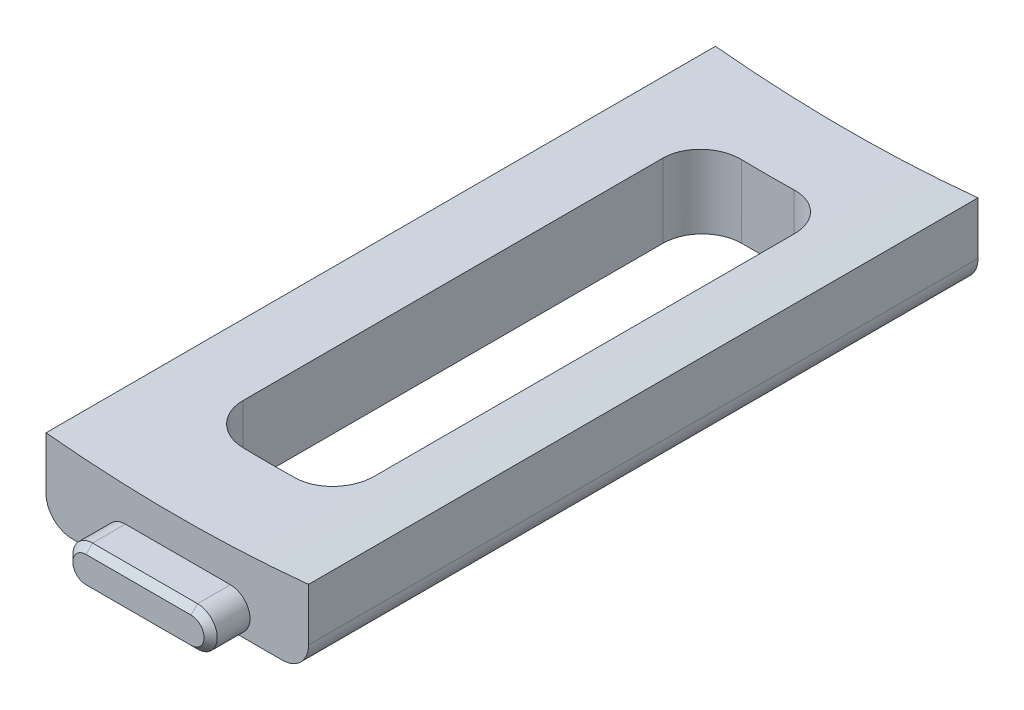
ISO-10303-21;
HEADER;
FILE_DESCRIPTION(('STEP AP214'),'2;1');
FILE_NAME('part.step','',(''),(''),'','','');
FILE_SCHEMA(('AUTOMOTIVE_DESIGN { 1 0 10303 214 1 1 1 1 }'));
ENDSEC;
DATA;
#1=APPLICATION_CONTEXT('core data for automotive mechanical design processes');
#2=APPLICATION_PROTOCOL_DEFINITION('international standard','automotive_design',2000,#1);
#3=PRODUCT_CONTEXT('',#1,'mechanical');
#4=PRODUCT('Part','Part','',(#3));
#5=PRODUCT_RELATED_PRODUCT_CATEGORY('part','',(#4));
#6=PRODUCT_DEFINITION_FORMATION('','',#4);
#7=PRODUCT_DEFINITION_CONTEXT('part definition',#1,'design');
#8=PRODUCT_DEFINITION('design','',#6,#7);
#9=PRODUCT_DEFINITION_SHAPE('','',#8);
#10=(LENGTH_UNIT() NAMED_UNIT(*) SI_UNIT(.MILLI.,.METRE.));
#11=(NAMED_UNIT(*) PLANE_ANGLE_UNIT() SI_UNIT($,.RADIAN.));
#12=(NAMED_UNIT(*) SI_UNIT($,.STERADIAN.) SOLID_ANGLE_UNIT());
#13=UNCERTAINTY_MEASURE_WITH_UNIT(LENGTH_MEASURE(1.E-05),#10,'distance_accuracy_value','');
#14=(GEOMETRIC_REPRESENTATION_CONTEXT(3) GLOBAL_UNCERTAINTY_ASSIGNED_CONTEXT((#13)) GLOBAL_UNIT_ASSIGNED_CONTEXT((#10,
#11,#12)) REPRESENTATION_CONTEXT('',''));
#15=CARTESIAN_POINT('',(0.,0.,0.));
#16=DIRECTION('',(0.,0.,1.));
#17=DIRECTION('',(1.,0.,0.));
#18=AXIS2_PLACEMENT_3D('',#15,#16,#17);
#19=CARTESIAN_POINT('',(-4.,0.,3.));
#20=DIRECTION('',(0.,0.,-1.));
#21=DIRECTION('',(-1.,0.,0.));
#22=AXIS2_PLACEMENT_3D('',#19,#20,#21);
#23=CYLINDRICAL_SURFACE('',#22,1.5);
#24=DIRECTION('',(0.,0.,-1.));
#25=VECTOR('',#24,1.);
#26=CARTESIAN_POINT('',(-4.,1.5,3.));
#27=LINE('',#26,#25);
#28=CARTESIAN_POINT('',(-4.,1.5,3.));
#29=VERTEX_POINT('',#28);
#30=CARTESIAN_POINT('',(-4.,1.5,0.500000000000014));
#31=VERTEX_POINT('',#30);
#32=EDGE_CURVE('E284',#29,#31,#27,.T.);
#33=ORIENTED_EDGE('',*,*,#32,.T.);
#34=CARTESIAN_POINT('',(-4.,0.,0.500000000000014));
#35=DIRECTION('',(0.,0.,1.));
#36=DIRECTION('',(1.,0.,0.));
#37=AXIS2_PLACEMENT_3D('',#34,#35,#36);
#38=CIRCLE('',#37,1.5);
#39=CARTESIAN_POINT('',(-4.,-1.5,0.500000000000014));
#40=VERTEX_POINT('',#39);
#41=EDGE_CURVE('E346',#31,#40,#38,.T.);
#42=ORIENTED_EDGE('',*,*,#41,.T.);
#43=DIRECTION('',(0.,0.,-1.));
#44=VECTOR('',#43,1.);
#45=CARTESIAN_POINT('',(-4.,-1.5,3.));
#46=LINE('',#45,#44);
#47=CARTESIAN_POINT('',(-4.,-1.5,3.));
#48=VERTEX_POINT('',#47);
#49=EDGE_CURVE('E293',#48,#40,#46,.T.);
#50=ORIENTED_EDGE('',*,*,#49,.F.);
#51=CARTESIAN_POINT('',(-4.,0.,3.));
#52=DIRECTION('',(0.,0.,1.));
#53=DIRECTION('',(1.,0.,0.));
#54=AXIS2_PLACEMENT_3D('',#51,#52,#53);
#55=CIRCLE('',#54,1.5);
#56=EDGE_CURVE('E275',#29,#48,#55,.T.);
#57=ORIENTED_EDGE('',*,*,#56,.F.);
#58=EDGE_LOOP('',(#33,#42,#50,#57));
#59=FACE_BOUND('',#58,.T.);
#60=ADVANCED_FACE('F36',(#59),#23,.T.);
#61=CARTESIAN_POINT('',(-4.,-1.5,3.));
#62=DIRECTION('',(0.,1.,0.));
#63=DIRECTION('',(0.,0.,1.));
#64=AXIS2_PLACEMENT_3D('',#61,#62,#63);
#65=PLANE('',#64);
#66=DIRECTION('',(-1.,0.,0.));
#67=VECTOR('',#66,1.);
#68=CARTESIAN_POINT('',(-5.,-1.5,47.));
#69=LINE('',#68,#67);
#70=CARTESIAN_POINT('',(2.,-1.5,47.));
#71=VERTEX_POINT('',#70);
#72=CARTESIAN_POINT('',(-2.,-1.5,47.));
#73=VERTEX_POINT('',#72);
#74=EDGE_CURVE('E745',#71,#73,#69,.T.);
#75=ORIENTED_EDGE('',*,*,#74,.F.);
#76=CARTESIAN_POINT('',(2.,-1.5,44.));
#77=DIRECTION('',(0.,1.,0.));
#78=DIRECTION('',(0.,0.,1.));
#79=AXIS2_PLACEMENT_3D('',#76,#77,#78);
#80=CIRCLE('',#79,3.);
#81=CARTESIAN_POINT('',(5.,-1.5,44.));
#82=VERTEX_POINT('',#81);
#83=EDGE_CURVE('E49',#71,#82,#80,.T.);
#84=ORIENTED_EDGE('',*,*,#83,.T.);
#85=DIRECTION('',(0.,0.,1.));
#86=VECTOR('',#85,1.);
#87=CARTESIAN_POINT('',(5.,-1.5,47.));
#88=LINE('',#87,#86);
#89=CARTESIAN_POINT('',(5.,-1.5,12.));
#90=VERTEX_POINT('',#89);
#91=EDGE_CURVE('E760',#90,#82,#88,.T.);
#92=ORIENTED_EDGE('',*,*,#91,.F.);
#93=CARTESIAN_POINT('',(2.,-1.5,12.));
#94=DIRECTION('',(0.,1.,0.));
#95=DIRECTION('',(0.,0.,1.));
#96=AXIS2_PLACEMENT_3D('',#93,#94,#95);
#97=CIRCLE('',#96,3.);
#98=CARTESIAN_POINT('',(2.,-1.5,9.00000000000001));
#99=VERTEX_POINT('',#98);
#100=EDGE_CURVE('E399',#90,#99,#97,.T.);
#101=ORIENTED_EDGE('',*,*,#100,.T.);
#102=DIRECTION('',(1.,0.,0.));
#103=VECTOR('',#102,1.);
#104=CARTESIAN_POINT('',(-5.,-1.5,9.00000000000001));
#105=LINE('',#104,#103);
#106=CARTESIAN_POINT('',(-2.,-1.5,9.00000000000001));
#107=VERTEX_POINT('',#106);
#108=EDGE_CURVE('E362',#107,#99,#105,.T.);
#109=ORIENTED_EDGE('',*,*,#108,.F.);
#110=CARTESIAN_POINT('',(-2.,-1.5,12.));
#111=DIRECTION('',(0.,1.,0.));
#112=DIRECTION('',(0.,0.,1.));
#113=AXIS2_PLACEMENT_3D('',#110,#111,#112);
#114=CIRCLE('',#113,3.);
#115=CARTESIAN_POINT('',(-5.,-1.5,12.));
#116=VERTEX_POINT('',#115);
#117=EDGE_CURVE('E407',#107,#116,#114,.T.);
#118=ORIENTED_EDGE('',*,*,#117,.T.);
#119=DIRECTION('',(0.,0.,-1.));
#120=VECTOR('',#119,1.);
#121=CARTESIAN_POINT('',(-5.,-1.5,47.));
#122=LINE('',#121,#120);
#123=CARTESIAN_POINT('',(-5.,-1.5,44.));
#124=VERTEX_POINT('',#123);
#125=EDGE_CURVE('E750',#124,#116,#122,.T.);
#126=ORIENTED_EDGE('',*,*,#125,.F.);
#127=CARTESIAN_POINT('',(-2.,-1.5,44.));
#128=DIRECTION('',(0.,1.,0.));
#129=DIRECTION('',(0.,0.,1.));
#130=AXIS2_PLACEMENT_3D('',#127,#128,#129);
#131=CIRCLE('',#130,3.);
#132=EDGE_CURVE('E56',#124,#73,#131,.T.);
#133=ORIENTED_EDGE('',*,*,#132,.T.);
#134=EDGE_LOOP('',(#75,#84,#92,#101,#109,#118,#126,#133));
#135=FACE_BOUND('',#134,.T.);
#136=DIRECTION('',(0.,0.,-1.));
#137=VECTOR('',#136,1.);
#138=CARTESIAN_POINT('',(4.04526737848605,-1.5,57.));
#139=LINE('',#138,#137);
#140=CARTESIAN_POINT('',(4.04526737848605,-1.5,56.5));
#141=VERTEX_POINT('',#140);
#142=CARTESIAN_POINT('',(4.04526737848605,-1.5,54.));
#143=VERTEX_POINT('',#142);
#144=EDGE_CURVE('E224',#141,#143,#139,.T.);
#145=ORIENTED_EDGE('',*,*,#144,.F.);
#146=DIRECTION('',(-1.,0.,0.));
#147=VECTOR('',#146,1.);
#148=CARTESIAN_POINT('',(-3.95473262151394,-1.5,56.5));
#149=LINE('',#148,#147);
#150=CARTESIAN_POINT('',(-3.95473262151394,-1.5,56.5));
#151=VERTEX_POINT('',#150);
#152=EDGE_CURVE('E329',#141,#151,#149,.T.);
#153=ORIENTED_EDGE('',*,*,#152,.T.);
#154=DIRECTION('',(0.,0.,-1.));
#155=VECTOR('',#154,1.);
#156=CARTESIAN_POINT('',(-3.95473262151394,-1.5,57.));
#157=LINE('',#156,#155);
#158=CARTESIAN_POINT('',(-3.95473262151394,-1.5,54.));
#159=VERTEX_POINT('',#158);
#160=EDGE_CURVE('E247',#151,#159,#157,.T.);
#161=ORIENTED_EDGE('',*,*,#160,.T.);
#162=DIRECTION('',(1.,0.,0.));
#163=VECTOR('',#162,1.);
#164=CARTESIAN_POINT('',(0.,-1.5,54.));
#165=LINE('',#164,#163);
#166=CARTESIAN_POINT('',(-8.,-1.5,54.));
#167=VERTEX_POINT('',#166);
#168=EDGE_CURVE('E250',#167,#159,#165,.T.);
#169=ORIENTED_EDGE('',*,*,#168,.F.);
#170=DIRECTION('',(0.,0.,-1.));
#171=VECTOR('',#170,1.);
#172=CARTESIAN_POINT('',(-8.,-1.5,3.));
#173=LINE('',#172,#171);
#174=CARTESIAN_POINT('',(-8.,-1.5,3.));
#175=VERTEX_POINT('',#174);
#176=EDGE_CURVE('E303',#167,#175,#173,.T.);
#177=ORIENTED_EDGE('',*,*,#176,.T.);
#178=DIRECTION('',(1.,0.,0.));
#179=VECTOR('',#178,1.);
#180=CARTESIAN_POINT('',(0.,-1.5,3.));
#181=LINE('',#180,#179);
#182=EDGE_CURVE('E261',#175,#48,#181,.T.);
#183=ORIENTED_EDGE('',*,*,#182,.T.);
#184=ORIENTED_EDGE('',*,*,#49,.T.);
#185=DIRECTION('',(1.,0.,0.));
#186=VECTOR('',#185,1.);
#187=CARTESIAN_POINT('',(-4.,-1.5,0.500000000000014));
#188=LINE('',#187,#186);
#189=CARTESIAN_POINT('',(4.,-1.5,0.500000000000014));
#190=VERTEX_POINT('',#189);
#191=EDGE_CURVE('E326',#40,#190,#188,.T.);
#192=ORIENTED_EDGE('',*,*,#191,.T.);
#193=DIRECTION('',(0.,0.,-1.));
#194=VECTOR('',#193,1.);
#195=CARTESIAN_POINT('',(4.,-1.5,3.));
#196=LINE('',#195,#194);
#197=CARTESIAN_POINT('',(4.,-1.5,3.));
#198=VERTEX_POINT('',#197);
#199=EDGE_CURVE('E290',#198,#190,#196,.T.);
#200=ORIENTED_EDGE('',*,*,#199,.F.);
#201=CARTESIAN_POINT('',(8.,-1.5,3.));
#202=VERTEX_POINT('',#201);
#203=EDGE_CURVE('E249',#198,#202,#181,.T.);
#204=ORIENTED_EDGE('',*,*,#203,.T.);
#205=DIRECTION('',(0.,0.,-1.));
#206=VECTOR('',#205,1.);
#207=CARTESIAN_POINT('',(8.,-1.5,3.));
#208=LINE('',#207,#206);
#209=CARTESIAN_POINT('',(8.,-1.5,54.));
#210=VERTEX_POINT('',#209);
#211=EDGE_CURVE('E306',#202,#210,#208,.F.);
#212=ORIENTED_EDGE('',*,*,#211,.T.);
#213=EDGE_CURVE('E253',#143,#210,#165,.T.);
#214=ORIENTED_EDGE('',*,*,#213,.F.);
#215=EDGE_LOOP('',(#145,#153,#161,#169,#177,#183,#184,#192,#200,#204,#212,#214));
#216=FACE_BOUND('',#215,.T.);
#217=ADVANCED_FACE('F451',(#135,#216),#65,.F.);
#218=CARTESIAN_POINT('',(4.,0.,3.));
#219=DIRECTION('',(0.,0.,-1.));
#220=DIRECTION('',(-1.,0.,0.));
#221=AXIS2_PLACEMENT_3D('',#218,#219,#220);
#222=CYLINDRICAL_SURFACE('',#221,1.5);
#223=ORIENTED_EDGE('',*,*,#199,.T.);
#224=CARTESIAN_POINT('',(4.,0.,0.500000000000014));
#225=DIRECTION('',(0.,0.,1.));
#226=DIRECTION('',(1.,0.,0.));
#227=AXIS2_PLACEMENT_3D('',#224,#225,#226);
#228=CIRCLE('',#227,1.5);
#229=CARTESIAN_POINT('',(4.,1.5,0.500000000000014));
#230=VERTEX_POINT('',#229);
#231=EDGE_CURVE('E342',#190,#230,#228,.T.);
#232=ORIENTED_EDGE('',*,*,#231,.T.);
#233=DIRECTION('',(0.,0.,-1.));
#234=VECTOR('',#233,1.);
#235=CARTESIAN_POINT('',(4.,1.5,3.));
#236=LINE('',#235,#234);
#237=CARTESIAN_POINT('',(4.,1.5,3.));
#238=VERTEX_POINT('',#237);
#239=EDGE_CURVE('E287',#238,#230,#236,.T.);
#240=ORIENTED_EDGE('',*,*,#239,.F.);
#241=CARTESIAN_POINT('',(4.,0.,3.));
#242=DIRECTION('',(0.,0.,1.));
#243=DIRECTION('',(1.,0.,0.));
#244=AXIS2_PLACEMENT_3D('',#241,#242,#243);
#245=CIRCLE('',#244,1.5);
#246=EDGE_CURVE('E278',#198,#238,#245,.T.);
#247=ORIENTED_EDGE('',*,*,#246,.F.);
#248=EDGE_LOOP('',(#223,#232,#240,#247));
#249=FACE_BOUND('',#248,.T.);
#250=ADVANCED_FACE('F457',(#249),#222,.T.);
#251=CARTESIAN_POINT('',(-4.,1.5,3.));
#252=DIRECTION('',(0.,-1.,0.));
#253=DIRECTION('',(0.,0.,-1.));
#254=AXIS2_PLACEMENT_3D('',#251,#252,#253);
#255=PLANE('',#254);
#256=ORIENTED_EDGE('',*,*,#239,.T.);
#257=DIRECTION('',(-1.,0.,0.));
#258=VECTOR('',#257,1.);
#259=CARTESIAN_POINT('',(-4.,1.5,0.500000000000014));
#260=LINE('',#259,#258);
#261=EDGE_CURVE('E344',#230,#31,#260,.T.);
#262=ORIENTED_EDGE('',*,*,#261,.T.);
#263=ORIENTED_EDGE('',*,*,#32,.F.);
#264=DIRECTION('',(-1.,0.,0.));
#265=VECTOR('',#264,1.);
#266=CARTESIAN_POINT('',(-4.,1.5,3.));
#267=LINE('',#266,#265);
#268=EDGE_CURVE('E281',#238,#29,#267,.T.);
#269=ORIENTED_EDGE('',*,*,#268,.F.);
#270=EDGE_LOOP('',(#256,#262,#263,#269));
#271=FACE_BOUND('',#270,.T.);
#272=ADVANCED_FACE('F529',(#271),#255,.F.);
#273=CARTESIAN_POINT('',(-4.,0.,0.));
#274=DIRECTION('',(0.,0.,1.));
#275=DIRECTION('',(1.,0.,0.));
#276=AXIS2_PLACEMENT_3D('',#273,#274,#275);
#277=PLANE('',#276);
#278=CARTESIAN_POINT('',(4.,0.,0.));
#279=DIRECTION('',(0.,0.,1.));
#280=DIRECTION('',(1.,0.,0.));
#281=AXIS2_PLACEMENT_3D('',#278,#279,#280);
#282=CIRCLE('',#281,0.999999999999987);
#283=CARTESIAN_POINT('',(4.,0.999999999999987,0.));
#284=VERTEX_POINT('',#283);
#285=CARTESIAN_POINT('',(4.,-0.999999999999985,0.));
#286=VERTEX_POINT('',#285);
#287=EDGE_CURVE('E337',#284,#286,#282,.F.);
#288=ORIENTED_EDGE('',*,*,#287,.T.);
#289=DIRECTION('',(-1.,0.,0.));
#290=VECTOR('',#289,1.);
#291=CARTESIAN_POINT('',(-4.,-0.999999999999987,0.));
#292=LINE('',#291,#290);
#293=CARTESIAN_POINT('',(-4.,-0.999999999999987,0.));
#294=VERTEX_POINT('',#293);
#295=EDGE_CURVE('E339',#286,#294,#292,.T.);
#296=ORIENTED_EDGE('',*,*,#295,.T.);
#297=CARTESIAN_POINT('',(-4.,0.,0.));
#298=DIRECTION('',(0.,0.,1.));
#299=DIRECTION('',(1.,0.,0.));
#300=AXIS2_PLACEMENT_3D('',#297,#298,#299);
#301=CIRCLE('',#300,0.999999999999987);
#302=CARTESIAN_POINT('',(-4.,0.999999999999987,0.));
#303=VERTEX_POINT('',#302);
#304=EDGE_CURVE('E333',#294,#303,#301,.F.);
#305=ORIENTED_EDGE('',*,*,#304,.T.);
#306=DIRECTION('',(1.,0.,0.));
#307=VECTOR('',#306,1.);
#308=CARTESIAN_POINT('',(-4.,0.999999999999987,0.));
#309=LINE('',#308,#307);
#310=EDGE_CURVE('E335',#303,#284,#309,.T.);
#311=ORIENTED_EDGE('',*,*,#310,.T.);
#312=EDGE_LOOP('',(#288,#296,#305,#311));
#313=FACE_BOUND('',#312,.T.);
#314=ADVANCED_FACE('F512',(#313),#277,.F.);
#315=CARTESIAN_POINT('',(0.,0.,3.));
#316=DIRECTION('',(0.,0.,1.));
#317=DIRECTION('',(1.,0.,0.));
#318=AXIS2_PLACEMENT_3D('',#315,#316,#317);
#319=PLANE('',#318);
#320=DIRECTION('',(0.,1.,0.));
#321=VECTOR('',#320,1.);
#322=CARTESIAN_POINT('',(10.,0.,3.));
#323=LINE('',#322,#321);
#324=CARTESIAN_POINT('',(10.,0.5,3.));
#325=VERTEX_POINT('',#324);
#326=CARTESIAN_POINT('',(10.,4.50125628933799,3.));
#327=VERTEX_POINT('',#326);
#328=EDGE_CURVE('E263',#325,#327,#323,.T.);
#329=ORIENTED_EDGE('',*,*,#328,.F.);
#330=CARTESIAN_POINT('',(8.,0.5,3.));
#331=DIRECTION('',(0.,0.,1.));
#332=DIRECTION('',(1.,0.,0.));
#333=AXIS2_PLACEMENT_3D('',#330,#331,#332);
#334=CIRCLE('',#333,2.);
#335=EDGE_CURVE('E301',#325,#202,#334,.F.);
#336=ORIENTED_EDGE('',*,*,#335,.T.);
#337=ORIENTED_EDGE('',*,*,#203,.F.);
#338=ORIENTED_EDGE('',*,*,#246,.T.);
#339=ORIENTED_EDGE('',*,*,#268,.T.);
#340=ORIENTED_EDGE('',*,*,#56,.T.);
#341=ORIENTED_EDGE('',*,*,#182,.F.);
#342=CARTESIAN_POINT('',(-8.,0.5,3.));
#343=DIRECTION('',(0.,0.,1.));
#344=DIRECTION('',(1.,0.,0.));
#345=AXIS2_PLACEMENT_3D('',#342,#343,#344);
#346=CIRCLE('',#345,2.);
#347=CARTESIAN_POINT('',(-10.,0.5,3.));
#348=VERTEX_POINT('',#347);
#349=EDGE_CURVE('E299',#175,#348,#346,.F.);
#350=ORIENTED_EDGE('',*,*,#349,.T.);
#351=DIRECTION('',(0.,1.,0.));
#352=VECTOR('',#351,1.);
#353=CARTESIAN_POINT('',(-10.,0.,3.));
#354=LINE('',#353,#352);
#355=CARTESIAN_POINT('',(-10.,4.50125628933799,3.));
#356=VERTEX_POINT('',#355);
#357=EDGE_CURVE('E268',#348,#356,#354,.T.);
#358=ORIENTED_EDGE('',*,*,#357,.T.);
#359=CARTESIAN_POINT('',(0.,104.,3.));
#360=DIRECTION('',(0.,0.,1.));
#361=DIRECTION('',(1.,0.,0.));
#362=AXIS2_PLACEMENT_3D('',#359,#360,#361);
#363=CIRCLE('',#362,100.);
#364=EDGE_CURVE('E265',#356,#327,#363,.T.);
#365=ORIENTED_EDGE('',*,*,#364,.T.);
#366=EDGE_LOOP('',(#329,#336,#337,#338,#339,#340,#341,#350,#358,#365));
#367=FACE_BOUND('',#366,.T.);
#368=ADVANCED_FACE('F525',(#367),#319,.F.);
#369=CARTESIAN_POINT('',(10.,0.,54.));
#370=DIRECTION('',(-1.,0.,0.));
#371=DIRECTION('',(0.,0.,1.));
#372=AXIS2_PLACEMENT_3D('',#369,#370,#371);
#373=PLANE('',#372);
#374=DIRECTION('',(0.,1.,0.));
#375=VECTOR('',#374,1.);
#376=CARTESIAN_POINT('',(10.,0.,54.));
#377=LINE('',#376,#375);
#378=CARTESIAN_POINT('',(10.,0.5,54.));
#379=VERTEX_POINT('',#378);
#380=CARTESIAN_POINT('',(10.,4.50125628933799,54.));
#381=VERTEX_POINT('',#380);
#382=EDGE_CURVE('E252',#379,#381,#377,.T.);
#383=ORIENTED_EDGE('',*,*,#382,.F.);
#384=DIRECTION('',(0.,0.,-1.));
#385=VECTOR('',#384,1.);
#386=CARTESIAN_POINT('',(10.,0.5,54.));
#387=LINE('',#386,#385);
#388=EDGE_CURVE('E296',#379,#325,#387,.T.);
#389=ORIENTED_EDGE('',*,*,#388,.T.);
#390=ORIENTED_EDGE('',*,*,#328,.T.);
#391=DIRECTION('',(0.,0.,-1.));
#392=VECTOR('',#391,1.);
#393=CARTESIAN_POINT('',(10.,4.50125628933799,54.));
#394=LINE('',#393,#392);
#395=EDGE_CURVE('E272',#381,#327,#394,.T.);
#396=ORIENTED_EDGE('',*,*,#395,.F.);
#397=EDGE_LOOP('',(#383,#389,#390,#396));
#398=FACE_BOUND('',#397,.T.);
#399=ADVANCED_FACE('F419',(#398),#373,.F.);
#400=CARTESIAN_POINT('',(0.,104.,54.));
#401=DIRECTION('',(0.,0.,-1.));
#402=DIRECTION('',(-1.,0.,0.));
#403=AXIS2_PLACEMENT_3D('',#400,#401,#402);
#404=CYLINDRICAL_SURFACE('',#403,100.);
#405=DIRECTION('',(0.,0.,-1.));
#406=VECTOR('',#405,1.);
#407=CARTESIAN_POINT('',(5.,4.12507822280909,54.));
#408=LINE('',#407,#406);
#409=CARTESIAN_POINT('',(5.,4.12507822280909,44.));
#410=VERTEX_POINT('',#409);
#411=CARTESIAN_POINT('',(5.,4.12507822280909,12.));
#412=VERTEX_POINT('',#411);
#413=EDGE_CURVE('E377',#410,#412,#408,.T.);
#414=ORIENTED_EDGE('',*,*,#413,.F.);
#415=CARTESIAN_POINT('',(5.,4.12507822280909,44.));
#416=CARTESIAN_POINT('',(5.00000814498808,4.12507942660806,44.0843160906977));
#417=CARTESIAN_POINT('',(4.9964454317208,4.12490029257833,44.1686282933475));
#418=CARTESIAN_POINT('',(4.98224131947821,4.12419029589252,44.3366485934392));
#419=CARTESIAN_POINT('',(4.97160028692525,4.1236594514434,44.4203567219255));
#420=CARTESIAN_POINT('',(4.94331389716537,4.12225554217067,44.5865147692355));
#421=CARTESIAN_POINT('',(4.92567416179516,4.12138275202827,44.6689656429056));
#422=CARTESIAN_POINT('',(4.88353431607412,4.11931351210027,44.8320662889402));
#423=CARTESIAN_POINT('',(4.8590342841207,4.11811706601333,44.9127160818756));
#424=CARTESIAN_POINT('',(4.77544433383261,4.11407358765031,45.1511831389334));
#425=CARTESIAN_POINT('',(4.70625244283795,4.11077179098361,45.3055888764195));
#426=CARTESIAN_POINT('',(4.54301089354706,4.10321486399377,45.600479672758));
#427=CARTESIAN_POINT('',(4.44896522677314,4.09895988676834,45.7409669619397));
#428=CARTESIAN_POINT('',(4.23857940291584,4.08981278035046,46.0042867457742));
#429=CARTESIAN_POINT('',(4.12222359159134,4.08492020455435,46.1271067373688));
#430=CARTESIAN_POINT('',(3.87053536876305,4.07485410454384,46.351495264));
#431=CARTESIAN_POINT('',(3.73519919236742,4.06968052471531,46.4530595728336));
#432=CARTESIAN_POINT('',(3.44925947230159,4.0594022469929,46.6321368900896));
#433=CARTESIAN_POINT('',(3.29863944644853,4.05429763033532,46.7096235594207));
#434=CARTESIAN_POINT('',(2.98654410826975,4.04448559538443,46.8381630408096));
#435=CARTESIAN_POINT('',(2.82507523060225,4.03977794531494,46.8892313684061));
#436=CARTESIAN_POINT('',(2.55218908089319,4.03251473311917,46.9508397022361));
#437=CARTESIAN_POINT('',(2.44249163670902,4.02977292484892,46.969262693972));
#438=CARTESIAN_POINT('',(2.22187949302137,4.02462536896807,46.9938414457761));
#439=CARTESIAN_POINT('',(2.11096671661919,4.0222191553986,47.0000143754011));
#440=CARTESIAN_POINT('',(2.,4.02000200040009,47.));
#441=B_SPLINE_CURVE_WITH_KNOTS('',3,(#415,#416,#417,#418,#419,#420,#421,#422,#423,#424,#425,
#426,#427,#428,#429,#430,#431,#432,#433,#434,#435,#436,#437,#438,#439,#440),.UNSPECIFIED.,.F.,
.F.,(4,2,2,2,2,2,2,2,2,2,2,2,4),(0.,0.252865840559253,0.5057185920668,0.75836864483334,
1.01101581050838,1.51609737369479,2.02109786990451,2.52645401248504,3.03191053823899,
3.53791806377939,4.04362807185568,4.3767928331811,4.70949030358541),.UNSPECIFIED.);
#442=CARTESIAN_POINT('',(2.,4.02000200040009,47.));
#443=VERTEX_POINT('',#442);
#444=EDGE_CURVE('E11',#410,#443,#441,.T.);
#445=ORIENTED_EDGE('',*,*,#444,.T.);
#446=CARTESIAN_POINT('',(0.,104.,47.));
#447=DIRECTION('',(0.,0.,1.));
#448=DIRECTION('',(1.,0.,0.));
#449=AXIS2_PLACEMENT_3D('',#446,#447,#448);
#450=CIRCLE('',#449,100.);
#451=CARTESIAN_POINT('',(-2.,4.02000200040009,47.));
#452=VERTEX_POINT('',#451);
#453=EDGE_CURVE('E348',#452,#443,#450,.T.);
#454=ORIENTED_EDGE('',*,*,#453,.F.);
#455=CARTESIAN_POINT('',(-2.,4.02000200040009,47.));
#456=CARTESIAN_POINT('',(-2.08440471498158,4.02168939327337,47.0000080934784));
#457=CARTESIAN_POINT('',(-2.16880330050162,4.02348564658434,46.9964379549062));
#458=CARTESIAN_POINT('',(-2.3369915925235,4.02727626437532,46.9822049954182));
#459=CARTESIAN_POINT('',(-2.42078133028275,4.02927061860687,46.9715425412505));
#460=CARTESIAN_POINT('',(-2.58709954659007,4.03343638875262,46.9431997306214));
#461=CARTESIAN_POINT('',(-2.66962895416165,4.03560766594774,46.9255248310907));
#462=CARTESIAN_POINT('',(-2.83288133264196,4.04010071208988,46.8833014563639));
#463=CARTESIAN_POINT('',(-2.91360432373913,4.0424224793539,46.8587530580272));
#464=CARTESIAN_POINT('',(-3.15228277388182,4.04957059726669,46.7749982818057));
#465=CARTESIAN_POINT('',(-3.30681846820339,4.05458156104764,46.7056701984044));
#466=CARTESIAN_POINT('',(-3.60194081689673,4.0647814445783,46.5421026061555));
#467=CARTESIAN_POINT('',(-3.7425297737481,4.069970334763,46.4478672187218));
#468=CARTESIAN_POINT('',(-4.00597239863439,4.08018424599097,46.2370801080684));
#469=CARTESIAN_POINT('',(-4.12881906036724,4.08520920169465,46.1205196108619));
#470=CARTESIAN_POINT('',(-4.35321696997438,4.09473408526897,45.8683841263345));
#471=CARTESIAN_POINT('',(-4.45476410203139,4.09923391159177,45.7328054724686));
#472=CARTESIAN_POINT('',(-4.63364586562891,4.10737079152132,45.4465158388333));
#473=CARTESIAN_POINT('',(-4.71098119807191,4.11100787010284,45.2958052972807));
#474=CARTESIAN_POINT('',(-4.83920405745343,4.11713735039983,44.9835462928739));
#475=CARTESIAN_POINT('',(-4.89010741254306,4.11963043706295,44.8220043817223));
#476=CARTESIAN_POINT('',(-4.95131174276999,4.12264972550112,44.549553843368));
#477=CARTESIAN_POINT('',(-4.96955851069598,4.12355761625383,44.4403683586929));
#478=CARTESIAN_POINT('',(-4.99390114863837,4.12477287239238,44.220803988175));
#479=CARTESIAN_POINT('',(-5.00001409551737,4.12508108174403,44.1104269996644));
#480=CARTESIAN_POINT('',(-5.,4.1250782228091,44.));
#481=B_SPLINE_CURVE_WITH_KNOTS('',3,(#455,#456,#457,#458,#459,#460,#461,#462,#463,#464,#465,
#466,#467,#468,#469,#470,#471,#472,#473,#474,#475,#476,#477,#478,#479,#480),.UNSPECIFIED.,.F.,
.F.,(4,2,2,2,2,2,2,2,2,2,2,2,4),(0.,0.25318212149904,0.506351151816436,0.759323556776108,
1.01229313311201,1.51801956258096,2.02366236178129,2.52950429283466,3.0354438804494,
3.54136882036691,4.04699044895239,4.37847148811356,4.70948567671865),.UNSPECIFIED.);
#482=CARTESIAN_POINT('',(-5.,4.12507822280909,44.));
#483=VERTEX_POINT('',#482);
#484=EDGE_CURVE('E432',#452,#483,#481,.T.);
#485=ORIENTED_EDGE('',*,*,#484,.T.);
#486=DIRECTION('',(0.,0.,-1.));
#487=VECTOR('',#486,1.);
#488=CARTESIAN_POINT('',(-5.,4.12507822280909,54.));
#489=LINE('',#488,#487);
#490=CARTESIAN_POINT('',(-5.,4.12507822280909,12.));
#491=VERTEX_POINT('',#490);
#492=EDGE_CURVE('E371',#491,#483,#489,.F.);
#493=ORIENTED_EDGE('',*,*,#492,.F.);
#494=CARTESIAN_POINT('',(-5.,4.12507822280909,12.));
#495=CARTESIAN_POINT('',(-5.00000814498808,4.12507942660806,11.9156839093023));
#496=CARTESIAN_POINT('',(-4.9964454317208,4.12490029257833,11.8313717066525));
#497=CARTESIAN_POINT('',(-4.98224131947821,4.12419029589252,11.6633514065608));
#498=CARTESIAN_POINT('',(-4.97160028692524,4.1236594514434,11.5796432780745));
#499=CARTESIAN_POINT('',(-4.94331389716536,4.12225554217067,11.4134852307645));
#500=CARTESIAN_POINT('',(-4.92567416179516,4.12138275202827,11.3310343570944));
#501=CARTESIAN_POINT('',(-4.88353431607412,4.11931351210027,11.1679337110598));
#502=CARTESIAN_POINT('',(-4.8590342841207,4.11811706601333,11.0872839181244));
#503=CARTESIAN_POINT('',(-4.77544433383261,4.11407358765031,10.8488168610666));
#504=CARTESIAN_POINT('',(-4.70625244283795,4.11077179098361,10.6944111235805));
#505=CARTESIAN_POINT('',(-4.54301089354706,4.10321486399377,10.399520327242));
#506=CARTESIAN_POINT('',(-4.44896522677314,4.09895988676834,10.2590330380603));
#507=CARTESIAN_POINT('',(-4.23857940291584,4.08981278035046,9.99571325422579));
#508=CARTESIAN_POINT('',(-4.12222359159134,4.08492020455435,9.87289326263119));
#509=CARTESIAN_POINT('',(-3.87053536876306,4.07485410454384,9.64850473599997));
#510=CARTESIAN_POINT('',(-3.73519919236742,4.06968052471531,9.5469404271664));
#511=CARTESIAN_POINT('',(-3.44925947230159,4.0594022469929,9.36786310991036));
#512=CARTESIAN_POINT('',(-3.29863944644853,4.05429763033532,9.29037644057932));
#513=CARTESIAN_POINT('',(-2.98654410826975,4.04448559538443,9.16183695919041));
#514=CARTESIAN_POINT('',(-2.82507523060225,4.03977794531493,9.11076863159387));
#515=CARTESIAN_POINT('',(-2.55218908089319,4.03251473311918,9.04916029776391));
#516=CARTESIAN_POINT('',(-2.44249163670901,4.02977292484893,9.03073730602799));
#517=CARTESIAN_POINT('',(-2.22187949302136,4.02462536896809,9.0061585542239));
#518=CARTESIAN_POINT('',(-2.11096671661919,4.02221915539861,8.99998562459891));
#519=CARTESIAN_POINT('',(-2.,4.02000200040009,9.));
#520=B_SPLINE_CURVE_WITH_KNOTS('',3,(#494,#495,#496,#497,#498,#499,#500,#501,#502,#503,#504,
#505,#506,#507,#508,#509,#510,#511,#512,#513,#514,#515,#516,#517,#518,#519),.UNSPECIFIED.,.F.,
.F.,(4,2,2,2,2,2,2,2,2,2,2,2,4),(0.,0.252865840559264,0.505718592066802,0.758368644833338,
1.01101581050838,1.51609737369478,2.02109786990451,2.52645401248504,3.03191053823899,
3.5379180637794,4.04362807185568,4.3767928331811,4.70949030358541),.UNSPECIFIED.);
#521=CARTESIAN_POINT('',(-2.,4.02000200040009,9.));
#522=VERTEX_POINT('',#521);
#523=EDGE_CURVE('E426',#491,#522,#520,.T.);
#524=ORIENTED_EDGE('',*,*,#523,.T.);
#525=CARTESIAN_POINT('',(0.,104.,9.));
#526=DIRECTION('',(0.,0.,-1.));
#527=DIRECTION('',(-1.,0.,0.));
#528=AXIS2_PLACEMENT_3D('',#525,#526,#527);
#529=CIRCLE('',#528,100.);
#530=CARTESIAN_POINT('',(2.,4.02000200040009,9.));
#531=VERTEX_POINT('',#530);
#532=EDGE_CURVE('E374',#531,#522,#529,.T.);
#533=ORIENTED_EDGE('',*,*,#532,.F.);
#534=CARTESIAN_POINT('',(2.,4.02000200040009,9.00000000000001));
#535=CARTESIAN_POINT('',(2.08440471498158,4.02168939327337,8.99999190652156));
#536=CARTESIAN_POINT('',(2.16880330050162,4.02348564658434,9.00356204509384));
#537=CARTESIAN_POINT('',(2.3369915925235,4.02727626437532,9.01779500458177));
#538=CARTESIAN_POINT('',(2.42078133028275,4.02927061860687,9.02845745874952));
#539=CARTESIAN_POINT('',(2.58709954659007,4.03343638875262,9.05680026937857));
#540=CARTESIAN_POINT('',(2.66962895416166,4.03560766594774,9.0744751689093));
#541=CARTESIAN_POINT('',(2.83288133264196,4.04010071208988,9.11669854363612));
#542=CARTESIAN_POINT('',(2.91360432373913,4.0424224793539,9.14124694197276));
#543=CARTESIAN_POINT('',(3.15228277388182,4.04957059726669,9.22500171819434));
#544=CARTESIAN_POINT('',(3.30681846820339,4.05458156104764,9.29432980159558));
#545=CARTESIAN_POINT('',(3.60194081689673,4.0647814445783,9.45789739384448));
#546=CARTESIAN_POINT('',(3.7425297737481,4.069970334763,9.55213278127816));
#547=CARTESIAN_POINT('',(4.00597239863439,4.08018424599097,9.76291989193164));
#548=CARTESIAN_POINT('',(4.12881906036724,4.08520920169465,9.87948038913811));
#549=CARTESIAN_POINT('',(4.35321696997438,4.09473408526897,10.1316158736655));
#550=CARTESIAN_POINT('',(4.45476410203139,4.09923391159177,10.2671945275314));
#551=CARTESIAN_POINT('',(4.63364586562891,4.10737079152132,10.5534841611667));
#552=CARTESIAN_POINT('',(4.71098119807191,4.11100787010284,10.7041947027193));
#553=CARTESIAN_POINT('',(4.83920405745343,4.11713735039983,11.0164537071261));
#554=CARTESIAN_POINT('',(4.89010741254306,4.11963043706295,11.1779956182777));
#555=CARTESIAN_POINT('',(4.95131174276999,4.12264972550112,11.450446156632));
#556=CARTESIAN_POINT('',(4.96955851069598,4.12355761625383,11.5596316413071));
#557=CARTESIAN_POINT('',(4.99390114863837,4.12477287239238,11.779196011825));
#558=CARTESIAN_POINT('',(5.00001409551737,4.12508108174403,11.8895730003356));
#559=CARTESIAN_POINT('',(5.,4.1250782228091,12.));
#560=B_SPLINE_CURVE_WITH_KNOTS('',3,(#534,#535,#536,#537,#538,#539,#540,#541,#542,#543,#544,
#545,#546,#547,#548,#549,#550,#551,#552,#553,#554,#555,#556,#557,#558,#559),.UNSPECIFIED.,.F.,
.F.,(4,2,2,2,2,2,2,2,2,2,2,2,4),(0.,0.25318212149904,0.506351151816437,0.759323556776109,
1.01229313311201,1.51801956258096,2.02366236178129,2.52950429283466,3.0354438804494,
3.54136882036691,4.04699044895239,4.37847148811357,4.70948567671865),.UNSPECIFIED.);
#561=EDGE_CURVE('E401',#531,#412,#560,.T.);
#562=ORIENTED_EDGE('',*,*,#561,.T.);
#563=EDGE_LOOP('',(#414,#445,#454,#485,#493,#524,#533,#562));
#564=FACE_BOUND('',#563,.T.);
#565=ORIENTED_EDGE('',*,*,#364,.F.);
#566=DIRECTION('',(0.,0.,-1.));
#567=VECTOR('',#566,1.);
#568=CARTESIAN_POINT('',(-10.,4.50125628933799,54.));
#569=LINE('',#568,#567);
#570=CARTESIAN_POINT('',(-10.,4.50125628933799,54.));
#571=VERTEX_POINT('',#570);
#572=EDGE_CURVE('E260',#571,#356,#569,.T.);
#573=ORIENTED_EDGE('',*,*,#572,.F.);
#574=CARTESIAN_POINT('',(0.,104.,54.));
#575=DIRECTION('',(0.,0.,1.));
#576=DIRECTION('',(1.,0.,0.));
#577=AXIS2_PLACEMENT_3D('',#574,#575,#576);
#578=CIRCLE('',#577,100.);
#579=EDGE_CURVE('E255',#571,#381,#578,.T.);
#580=ORIENTED_EDGE('',*,*,#579,.T.);
#581=ORIENTED_EDGE('',*,*,#395,.T.);
#582=EDGE_LOOP('',(#565,#573,#580,#581));
#583=FACE_BOUND('',#582,.T.);
#584=ADVANCED_FACE('F413',(#564,#583),#404,.F.);
#585=CARTESIAN_POINT('',(-10.,0.,54.));
#586=DIRECTION('',(-1.,0.,0.));
#587=DIRECTION('',(0.,0.,1.));
#588=AXIS2_PLACEMENT_3D('',#585,#586,#587);
#589=PLANE('',#588);
#590=ORIENTED_EDGE('',*,*,#357,.F.);
#591=DIRECTION('',(0.,0.,-1.));
#592=VECTOR('',#591,1.);
#593=CARTESIAN_POINT('',(-10.,0.5,54.));
#594=LINE('',#593,#592);
#595=CARTESIAN_POINT('',(-10.,0.5,54.));
#596=VERTEX_POINT('',#595);
#597=EDGE_CURVE('E312',#348,#596,#594,.F.);
#598=ORIENTED_EDGE('',*,*,#597,.T.);
#599=DIRECTION('',(0.,1.,0.));
#600=VECTOR('',#599,1.);
#601=CARTESIAN_POINT('',(-10.,0.,54.));
#602=LINE('',#601,#600);
#603=EDGE_CURVE('E258',#596,#571,#602,.T.);
#604=ORIENTED_EDGE('',*,*,#603,.T.);
#605=ORIENTED_EDGE('',*,*,#572,.T.);
#606=EDGE_LOOP('',(#590,#598,#604,#605));
#607=FACE_BOUND('',#606,.T.);
#608=ADVANCED_FACE('F418',(#607),#589,.T.);
#609=CARTESIAN_POINT('',(0.,0.,54.));
#610=DIRECTION('',(0.,0.,1.));
#611=DIRECTION('',(1.,0.,0.));
#612=AXIS2_PLACEMENT_3D('',#609,#610,#611);
#613=PLANE('',#612);
#614=ORIENTED_EDGE('',*,*,#213,.T.);
#615=CARTESIAN_POINT('',(8.,0.5,54.));
#616=DIRECTION('',(0.,0.,1.));
#617=DIRECTION('',(1.,0.,0.));
#618=AXIS2_PLACEMENT_3D('',#615,#616,#617);
#619=CIRCLE('',#618,2.);
#620=EDGE_CURVE('E310',#210,#379,#619,.T.);
#621=ORIENTED_EDGE('',*,*,#620,.T.);
#622=ORIENTED_EDGE('',*,*,#382,.T.);
#623=ORIENTED_EDGE('',*,*,#579,.F.);
#624=ORIENTED_EDGE('',*,*,#603,.F.);
#625=CARTESIAN_POINT('',(-8.,0.5,54.));
#626=DIRECTION('',(0.,0.,1.));
#627=DIRECTION('',(1.,0.,0.));
#628=AXIS2_PLACEMENT_3D('',#625,#626,#627);
#629=CIRCLE('',#628,2.);
#630=EDGE_CURVE('E308',#596,#167,#629,.T.);
#631=ORIENTED_EDGE('',*,*,#630,.T.);
#632=ORIENTED_EDGE('',*,*,#168,.T.);
#633=CARTESIAN_POINT('',(-3.95473262151394,0.,54.));
#634=DIRECTION('',(0.,0.,1.));
#635=DIRECTION('',(1.,0.,0.));
#636=AXIS2_PLACEMENT_3D('',#633,#634,#635);
#637=CIRCLE('',#636,1.5);
#638=CARTESIAN_POINT('',(-3.95473262151394,1.5,54.));
#639=VERTEX_POINT('',#638);
#640=EDGE_CURVE('E236',#639,#159,#637,.T.);
#641=ORIENTED_EDGE('',*,*,#640,.F.);
#642=DIRECTION('',(-1.,0.,0.));
#643=VECTOR('',#642,1.);
#644=CARTESIAN_POINT('',(-3.95473262151394,1.5,54.));
#645=LINE('',#644,#643);
#646=CARTESIAN_POINT('',(4.04526737848605,1.5,54.));
#647=VERTEX_POINT('',#646);
#648=EDGE_CURVE('E219',#647,#639,#645,.T.);
#649=ORIENTED_EDGE('',*,*,#648,.F.);
#650=CARTESIAN_POINT('',(4.04526737848605,0.,54.));
#651=DIRECTION('',(0.,0.,1.));
#652=DIRECTION('',(1.,0.,0.));
#653=AXIS2_PLACEMENT_3D('',#650,#651,#652);
#654=CIRCLE('',#653,1.5);
#655=EDGE_CURVE('E232',#143,#647,#654,.T.);
#656=ORIENTED_EDGE('',*,*,#655,.F.);
#657=EDGE_LOOP('',(#614,#621,#622,#623,#624,#631,#632,#641,#649,#656));
#658=FACE_BOUND('',#657,.T.);
#659=ADVANCED_FACE('F231',(#658),#613,.T.);
#660=CARTESIAN_POINT('',(-3.95473262151394,0.,57.));
#661=DIRECTION('',(0.,0.,-1.));
#662=DIRECTION('',(-1.,0.,0.));
#663=AXIS2_PLACEMENT_3D('',#660,#661,#662);
#664=CYLINDRICAL_SURFACE('',#663,1.5);
#665=ORIENTED_EDGE('',*,*,#160,.F.);
#666=CARTESIAN_POINT('',(-3.95473262151394,0.,56.5));
#667=DIRECTION('',(0.,0.,1.));
#668=DIRECTION('',(1.,0.,0.));
#669=AXIS2_PLACEMENT_3D('',#666,#667,#668);
#670=CIRCLE('',#669,1.5);
#671=CARTESIAN_POINT('',(-3.95473262151394,1.5,56.5));
#672=VERTEX_POINT('',#671);
#673=EDGE_CURVE('E331',#151,#672,#670,.F.);
#674=ORIENTED_EDGE('',*,*,#673,.T.);
#675=DIRECTION('',(0.,0.,-1.));
#676=VECTOR('',#675,1.);
#677=CARTESIAN_POINT('',(-3.95473262151394,1.5,57.));
#678=LINE('',#677,#676);
#679=EDGE_CURVE('E225',#672,#639,#678,.T.);
#680=ORIENTED_EDGE('',*,*,#679,.T.);
#681=ORIENTED_EDGE('',*,*,#640,.T.);
#682=EDGE_LOOP('',(#665,#674,#680,#681));
#683=FACE_BOUND('',#682,.T.);
#684=ADVANCED_FACE('F552',(#683),#664,.T.);
#685=CARTESIAN_POINT('',(4.04526737848605,0.,57.));
#686=DIRECTION('',(0.,0.,-1.));
#687=DIRECTION('',(-1.,0.,0.));
#688=AXIS2_PLACEMENT_3D('',#685,#686,#687);
#689=CYLINDRICAL_SURFACE('',#688,1.5);
#690=DIRECTION('',(0.,0.,-1.));
#691=VECTOR('',#690,1.);
#692=CARTESIAN_POINT('',(4.04526737848605,1.5,57.));
#693=LINE('',#692,#691);
#694=CARTESIAN_POINT('',(4.04526737848605,1.5,56.5));
#695=VERTEX_POINT('',#694);
#696=EDGE_CURVE('E215',#695,#647,#693,.T.);
#697=ORIENTED_EDGE('',*,*,#696,.F.);
#698=CARTESIAN_POINT('',(4.04526737848605,0.,56.5));
#699=DIRECTION('',(0.,0.,1.));
#700=DIRECTION('',(1.,0.,0.));
#701=AXIS2_PLACEMENT_3D('',#698,#699,#700);
#702=CIRCLE('',#701,1.5);
#703=EDGE_CURVE('E324',#695,#141,#702,.F.);
#704=ORIENTED_EDGE('',*,*,#703,.T.);
#705=ORIENTED_EDGE('',*,*,#144,.T.);
#706=ORIENTED_EDGE('',*,*,#655,.T.);
#707=EDGE_LOOP('',(#697,#704,#705,#706));
#708=FACE_BOUND('',#707,.T.);
#709=ADVANCED_FACE('F238',(#708),#689,.T.);
#710=CARTESIAN_POINT('',(-3.95473262151394,1.5,57.));
#711=DIRECTION('',(0.,-1.,0.));
#712=DIRECTION('',(0.,0.,-1.));
#713=AXIS2_PLACEMENT_3D('',#710,#711,#712);
#714=PLANE('',#713);
#715=ORIENTED_EDGE('',*,*,#679,.F.);
#716=DIRECTION('',(1.,0.,0.));
#717=VECTOR('',#716,1.);
#718=CARTESIAN_POINT('',(4.04526737848605,1.5,56.5));
#719=LINE('',#718,#717);
#720=EDGE_CURVE('E221',#672,#695,#719,.T.);
#721=ORIENTED_EDGE('',*,*,#720,.T.);
#722=ORIENTED_EDGE('',*,*,#696,.T.);
#723=ORIENTED_EDGE('',*,*,#648,.T.);
#724=EDGE_LOOP('',(#715,#721,#722,#723));
#725=FACE_BOUND('',#724,.T.);
#726=ADVANCED_FACE('F218',(#725),#714,.F.);
#727=CARTESIAN_POINT('',(-3.95473262151394,0.,57.));
#728=DIRECTION('',(0.,0.,1.));
#729=DIRECTION('',(1.,0.,0.));
#730=AXIS2_PLACEMENT_3D('',#727,#728,#729);
#731=PLANE('',#730);
#732=CARTESIAN_POINT('',(4.04526737848605,0.,57.));
#733=DIRECTION('',(0.,0.,1.));
#734=DIRECTION('',(1.,0.,0.));
#735=AXIS2_PLACEMENT_3D('',#732,#733,#734);
#736=CIRCLE('',#735,1.00000000000002);
#737=CARTESIAN_POINT('',(4.04526737848605,-1.00000000000002,57.));
#738=VERTEX_POINT('',#737);
#739=CARTESIAN_POINT('',(4.04526737848605,1.00000000000002,57.));
#740=VERTEX_POINT('',#739);
#741=EDGE_CURVE('E318',#738,#740,#736,.T.);
#742=ORIENTED_EDGE('',*,*,#741,.T.);
#743=DIRECTION('',(-1.,0.,0.));
#744=VECTOR('',#743,1.);
#745=CARTESIAN_POINT('',(-3.95473262151394,1.00000000000002,57.));
#746=LINE('',#745,#744);
#747=CARTESIAN_POINT('',(-3.95473262151394,1.00000000000002,57.));
#748=VERTEX_POINT('',#747);
#749=EDGE_CURVE('E320',#740,#748,#746,.T.);
#750=ORIENTED_EDGE('',*,*,#749,.T.);
#751=CARTESIAN_POINT('',(-3.95473262151394,0.,57.));
#752=DIRECTION('',(0.,0.,1.));
#753=DIRECTION('',(1.,0.,0.));
#754=AXIS2_PLACEMENT_3D('',#751,#752,#753);
#755=CIRCLE('',#754,1.00000000000002);
#756=CARTESIAN_POINT('',(-3.95473262151394,-1.00000000000002,57.));
#757=VERTEX_POINT('',#756);
#758=EDGE_CURVE('E314',#748,#757,#755,.T.);
#759=ORIENTED_EDGE('',*,*,#758,.T.);
#760=DIRECTION('',(1.,0.,0.));
#761=VECTOR('',#760,1.);
#762=CARTESIAN_POINT('',(4.04526737848605,-1.00000000000002,57.));
#763=LINE('',#762,#761);
#764=EDGE_CURVE('E316',#757,#738,#763,.T.);
#765=ORIENTED_EDGE('',*,*,#764,.T.);
#766=EDGE_LOOP('',(#742,#750,#759,#765));
#767=FACE_BOUND('',#766,.T.);
#768=ADVANCED_FACE('F465',(#767),#731,.T.);
#769=CARTESIAN_POINT('',(8.,0.5,54.));
#770=DIRECTION('',(0.,0.,-1.));
#771=DIRECTION('',(-1.,0.,0.));
#772=AXIS2_PLACEMENT_3D('',#769,#770,#771);
#773=CYLINDRICAL_SURFACE('',#772,2.);
#774=ORIENTED_EDGE('',*,*,#620,.F.);
#775=ORIENTED_EDGE('',*,*,#211,.F.);
#776=ORIENTED_EDGE('',*,*,#335,.F.);
#777=ORIENTED_EDGE('',*,*,#388,.F.);
#778=EDGE_LOOP('',(#774,#775,#776,#777));
#779=FACE_BOUND('',#778,.T.);
#780=ADVANCED_FACE('F461',(#779),#773,.T.);
#781=CARTESIAN_POINT('',(-8.,0.5,3.));
#782=DIRECTION('',(0.,0.,1.));
#783=DIRECTION('',(1.,0.,0.));
#784=AXIS2_PLACEMENT_3D('',#781,#782,#783);
#785=CYLINDRICAL_SURFACE('',#784,2.);
#786=ORIENTED_EDGE('',*,*,#630,.F.);
#787=ORIENTED_EDGE('',*,*,#597,.F.);
#788=ORIENTED_EDGE('',*,*,#349,.F.);
#789=ORIENTED_EDGE('',*,*,#176,.F.);
#790=EDGE_LOOP('',(#786,#787,#788,#789));
#791=FACE_BOUND('',#790,.T.);
#792=ADVANCED_FACE('F464',(#791),#785,.T.);
#793=CARTESIAN_POINT('',(-3.95473262151394,-1.00000000000002,57.));
#794=DIRECTION('',(0.,-0.707106781186554,0.707106781186541));
#795=DIRECTION('',(-1.,0.,0.));
#796=AXIS2_PLACEMENT_3D('',#793,#794,#795);
#797=PLANE('',#796);
#798=DIRECTION('',(0.,0.707106781186541,0.707106781186554));
#799=VECTOR('',#798,1.);
#800=CARTESIAN_POINT('',(-3.95473262151394,-1.5,56.5));
#801=LINE('',#800,#799);
#802=EDGE_CURVE('E354',#151,#757,#801,.T.);
#803=ORIENTED_EDGE('',*,*,#802,.F.);
#804=ORIENTED_EDGE('',*,*,#152,.F.);
#805=DIRECTION('',(0.,-0.707106781186541,-0.707106781186554));
#806=VECTOR('',#805,1.);
#807=CARTESIAN_POINT('',(4.04526737848605,-1.00000000000002,57.));
#808=LINE('',#807,#806);
#809=EDGE_CURVE('E241',#738,#141,#808,.T.);
#810=ORIENTED_EDGE('',*,*,#809,.F.);
#811=ORIENTED_EDGE('',*,*,#764,.F.);
#812=EDGE_LOOP('',(#803,#804,#810,#811));
#813=FACE_BOUND('',#812,.T.);
#814=ADVANCED_FACE('F469',(#813),#797,.T.);
#815=CARTESIAN_POINT('',(4.04526737848605,0.,57.));
#816=DIRECTION('',(0.,0.,-1.));
#817=DIRECTION('',(-1.,0.,0.));
#818=AXIS2_PLACEMENT_3D('',#815,#816,#817);
#819=CONICAL_SURFACE('',#818,1.00000000000002,0.78539816339744);
#820=ORIENTED_EDGE('',*,*,#809,.T.);
#821=ORIENTED_EDGE('',*,*,#703,.F.);
#822=DIRECTION('',(0.,0.707106781186541,-0.707106781186554));
#823=VECTOR('',#822,1.);
#824=CARTESIAN_POINT('',(4.04526737848605,1.00000000000002,57.));
#825=LINE('',#824,#823);
#826=EDGE_CURVE('E351',#740,#695,#825,.T.);
#827=ORIENTED_EDGE('',*,*,#826,.F.);
#828=ORIENTED_EDGE('',*,*,#741,.F.);
#829=EDGE_LOOP('',(#820,#821,#827,#828));
#830=FACE_BOUND('',#829,.T.);
#831=ADVANCED_FACE('F479',(#830),#819,.T.);
#832=CARTESIAN_POINT('',(-3.95473262151394,0.,57.));
#833=DIRECTION('',(0.,0.,-1.));
#834=DIRECTION('',(-1.,0.,0.));
#835=AXIS2_PLACEMENT_3D('',#832,#833,#834);
#836=CONICAL_SURFACE('',#835,1.00000000000002,0.78539816339744);
#837=ORIENTED_EDGE('',*,*,#802,.T.);
#838=ORIENTED_EDGE('',*,*,#758,.F.);
#839=DIRECTION('',(0.,-0.707106781186541,0.707106781186554));
#840=VECTOR('',#839,1.);
#841=CARTESIAN_POINT('',(-3.95473262151394,1.5,56.5));
#842=LINE('',#841,#840);
#843=EDGE_CURVE('E349',#672,#748,#842,.T.);
#844=ORIENTED_EDGE('',*,*,#843,.F.);
#845=ORIENTED_EDGE('',*,*,#673,.F.);
#846=EDGE_LOOP('',(#837,#838,#844,#845));
#847=FACE_BOUND('',#846,.T.);
#848=ADVANCED_FACE('F475',(#847),#836,.T.);
#849=CARTESIAN_POINT('',(-3.95473262151394,1.00000000000002,57.));
#850=DIRECTION('',(0.,0.707106781186554,0.707106781186541));
#851=DIRECTION('',(1.,0.,0.));
#852=AXIS2_PLACEMENT_3D('',#849,#850,#851);
#853=PLANE('',#852);
#854=ORIENTED_EDGE('',*,*,#826,.T.);
#855=ORIENTED_EDGE('',*,*,#720,.F.);
#856=ORIENTED_EDGE('',*,*,#843,.T.);
#857=ORIENTED_EDGE('',*,*,#749,.F.);
#858=EDGE_LOOP('',(#854,#855,#856,#857));
#859=FACE_BOUND('',#858,.T.);
#860=ADVANCED_FACE('F471',(#859),#853,.T.);
#861=CARTESIAN_POINT('',(-4.,1.5,0.500000000000014));
#862=DIRECTION('',(0.,-0.707106781186548,0.707106781186547));
#863=DIRECTION('',(-1.,0.,0.));
#864=AXIS2_PLACEMENT_3D('',#861,#862,#863);
#865=PLANE('',#864);
#866=DIRECTION('',(0.,0.707106781186547,0.707106781186548));
#867=VECTOR('',#866,1.);
#868=CARTESIAN_POINT('',(4.,0.999999999999987,0.));
#869=LINE('',#868,#867);
#870=EDGE_CURVE('E364',#284,#230,#869,.T.);
#871=ORIENTED_EDGE('',*,*,#870,.F.);
#872=ORIENTED_EDGE('',*,*,#310,.F.);
#873=DIRECTION('',(0.,-0.707106781186547,-0.707106781186548));
#874=VECTOR('',#873,1.);
#875=CARTESIAN_POINT('',(-4.,1.5,0.500000000000014));
#876=LINE('',#875,#874);
#877=EDGE_CURVE('E352',#31,#303,#876,.T.);
#878=ORIENTED_EDGE('',*,*,#877,.F.);
#879=ORIENTED_EDGE('',*,*,#261,.F.);
#880=EDGE_LOOP('',(#871,#872,#878,#879));
#881=FACE_BOUND('',#880,.T.);
#882=ADVANCED_FACE('F474',(#881),#865,.F.);
#883=CARTESIAN_POINT('',(-4.,0.,0.500000000000014));
#884=DIRECTION('',(0.,0.,1.));
#885=DIRECTION('',(1.,0.,0.));
#886=AXIS2_PLACEMENT_3D('',#883,#884,#885);
#887=CONICAL_SURFACE('',#886,1.5,0.785398163397447);
#888=ORIENTED_EDGE('',*,*,#877,.T.);
#889=ORIENTED_EDGE('',*,*,#304,.F.);
#890=DIRECTION('',(0.,0.707106781186547,-0.707106781186548));
#891=VECTOR('',#890,1.);
#892=CARTESIAN_POINT('',(-4.,-1.5,0.500000000000014));
#893=LINE('',#892,#891);
#894=EDGE_CURVE('E361',#40,#294,#893,.T.);
#895=ORIENTED_EDGE('',*,*,#894,.F.);
#896=ORIENTED_EDGE('',*,*,#41,.F.);
#897=EDGE_LOOP('',(#888,#889,#895,#896));
#898=FACE_BOUND('',#897,.T.);
#899=ADVANCED_FACE('F495',(#898),#887,.T.);
#900=CARTESIAN_POINT('',(4.,0.,0.500000000000014));
#901=DIRECTION('',(0.,0.,1.));
#902=DIRECTION('',(1.,0.,0.));
#903=AXIS2_PLACEMENT_3D('',#900,#901,#902);
#904=CONICAL_SURFACE('',#903,1.5,0.785398163397447);
#905=ORIENTED_EDGE('',*,*,#870,.T.);
#906=ORIENTED_EDGE('',*,*,#231,.F.);
#907=DIRECTION('',(0.,-0.707106781186547,0.707106781186548));
#908=VECTOR('',#907,1.);
#909=CARTESIAN_POINT('',(4.,-0.999999999999985,0.));
#910=LINE('',#909,#908);
#911=EDGE_CURVE('E359',#286,#190,#910,.T.);
#912=ORIENTED_EDGE('',*,*,#911,.F.);
#913=ORIENTED_EDGE('',*,*,#287,.F.);
#914=EDGE_LOOP('',(#905,#906,#912,#913));
#915=FACE_BOUND('',#914,.T.);
#916=ADVANCED_FACE('F491',(#915),#904,.T.);
#917=CARTESIAN_POINT('',(-4.,-1.5,0.500000000000014));
#918=DIRECTION('',(0.,0.707106781186548,0.707106781186547));
#919=DIRECTION('',(1.,0.,0.));
#920=AXIS2_PLACEMENT_3D('',#917,#918,#919);
#921=PLANE('',#920);
#922=ORIENTED_EDGE('',*,*,#894,.T.);
#923=ORIENTED_EDGE('',*,*,#295,.F.);
#924=ORIENTED_EDGE('',*,*,#911,.T.);
#925=ORIENTED_EDGE('',*,*,#191,.F.);
#926=EDGE_LOOP('',(#922,#923,#924,#925));
#927=FACE_BOUND('',#926,.T.);
#928=ADVANCED_FACE('F487',(#927),#921,.F.);
#929=CARTESIAN_POINT('',(5.,4.50125628933799,47.));
#930=DIRECTION('',(1.,0.,0.));
#931=DIRECTION('',(0.,0.,-1.));
#932=AXIS2_PLACEMENT_3D('',#929,#930,#931);
#933=PLANE('',#932);
#934=ORIENTED_EDGE('',*,*,#413,.T.);
#935=DIRECTION('',(0.,-1.,0.));
#936=VECTOR('',#935,1.);
#937=CARTESIAN_POINT('',(5.,-1.5,12.));
#938=LINE('',#937,#936);
#939=EDGE_CURVE('E382',#412,#90,#938,.T.);
#940=ORIENTED_EDGE('',*,*,#939,.T.);
#941=ORIENTED_EDGE('',*,*,#91,.T.);
#942=DIRECTION('',(0.,-1.,0.));
#943=VECTOR('',#942,1.);
#944=CARTESIAN_POINT('',(5.,4.12507822280909,44.));
#945=LINE('',#944,#943);
#946=EDGE_CURVE('E380',#82,#410,#945,.F.);
#947=ORIENTED_EDGE('',*,*,#946,.T.);
#948=EDGE_LOOP('',(#934,#940,#941,#947));
#949=FACE_BOUND('',#948,.T.);
#950=ADVANCED_FACE('F490',(#949),#933,.F.);
#951=CARTESIAN_POINT('',(-5.,4.50125628933799,9.00000000000001));
#952=DIRECTION('',(0.,0.,-1.));
#953=DIRECTION('',(-1.,0.,0.));
#954=AXIS2_PLACEMENT_3D('',#951,#952,#953);
#955=PLANE('',#954);
#956=ORIENTED_EDGE('',*,*,#108,.T.);
#957=DIRECTION('',(0.,-1.,0.));
#958=VECTOR('',#957,1.);
#959=CARTESIAN_POINT('',(2.,4.12507822280909,9.00000000000001));
#960=LINE('',#959,#958);
#961=EDGE_CURVE('E388',#99,#531,#960,.F.);
#962=ORIENTED_EDGE('',*,*,#961,.T.);
#963=ORIENTED_EDGE('',*,*,#532,.T.);
#964=DIRECTION('',(0.,-1.,0.));
#965=VECTOR('',#964,1.);
#966=CARTESIAN_POINT('',(-2.,-1.5,9.00000000000001));
#967=LINE('',#966,#965);
#968=EDGE_CURVE('E385',#522,#107,#967,.T.);
#969=ORIENTED_EDGE('',*,*,#968,.T.);
#970=EDGE_LOOP('',(#956,#962,#963,#969));
#971=FACE_BOUND('',#970,.T.);
#972=ADVANCED_FACE('F684',(#971),#955,.F.);
#973=CARTESIAN_POINT('',(-5.,4.50125628933799,47.));
#974=DIRECTION('',(-1.,0.,0.));
#975=DIRECTION('',(0.,0.,1.));
#976=AXIS2_PLACEMENT_3D('',#973,#974,#975);
#977=PLANE('',#976);
#978=ORIENTED_EDGE('',*,*,#125,.T.);
#979=DIRECTION('',(0.,-1.,0.));
#980=VECTOR('',#979,1.);
#981=CARTESIAN_POINT('',(-5.,4.12507822280909,12.));
#982=LINE('',#981,#980);
#983=EDGE_CURVE('E393',#116,#491,#982,.F.);
#984=ORIENTED_EDGE('',*,*,#983,.T.);
#985=ORIENTED_EDGE('',*,*,#492,.T.);
#986=DIRECTION('',(0.,-1.,0.));
#987=VECTOR('',#986,1.);
#988=CARTESIAN_POINT('',(-5.,-1.5,44.));
#989=LINE('',#988,#987);
#990=EDGE_CURVE('E390',#483,#124,#989,.T.);
#991=ORIENTED_EDGE('',*,*,#990,.T.);
#992=EDGE_LOOP('',(#978,#984,#985,#991));
#993=FACE_BOUND('',#992,.T.);
#994=ADVANCED_FACE('F694',(#993),#977,.F.);
#995=CARTESIAN_POINT('',(-5.,4.50125628933799,47.));
#996=DIRECTION('',(0.,0.,1.));
#997=DIRECTION('',(1.,0.,0.));
#998=AXIS2_PLACEMENT_3D('',#995,#996,#997);
#999=PLANE('',#998);
#1000=ORIENTED_EDGE('',*,*,#74,.T.);
#1001=DIRECTION('',(0.,-1.,0.));
#1002=VECTOR('',#1001,1.);
#1003=CARTESIAN_POINT('',(-2.,4.12507822280909,47.));
#1004=LINE('',#1003,#1002);
#1005=EDGE_CURVE('E397',#73,#452,#1004,.F.);
#1006=ORIENTED_EDGE('',*,*,#1005,.T.);
#1007=ORIENTED_EDGE('',*,*,#453,.T.);
#1008=DIRECTION('',(0.,-1.,0.));
#1009=VECTOR('',#1008,1.);
#1010=CARTESIAN_POINT('',(2.,-1.5,47.));
#1011=LINE('',#1010,#1009);
#1012=EDGE_CURVE('E395',#443,#71,#1011,.T.);
#1013=ORIENTED_EDGE('',*,*,#1012,.T.);
#1014=EDGE_LOOP('',(#1000,#1006,#1007,#1013));
#1015=FACE_BOUND('',#1014,.T.);
#1016=ADVANCED_FACE('F447',(#1015),#999,.F.);
#1017=CARTESIAN_POINT('',(2.,4.50125628933799,12.));
#1018=DIRECTION('',(0.,1.,0.));
#1019=DIRECTION('',(0.,0.,1.));
#1020=AXIS2_PLACEMENT_3D('',#1017,#1018,#1019);
#1021=CYLINDRICAL_SURFACE('',#1020,3.);
#1022=ORIENTED_EDGE('',*,*,#561,.F.);
#1023=ORIENTED_EDGE('',*,*,#961,.F.);
#1024=ORIENTED_EDGE('',*,*,#100,.F.);
#1025=ORIENTED_EDGE('',*,*,#939,.F.);
#1026=EDGE_LOOP('',(#1022,#1023,#1024,#1025));
#1027=FACE_BOUND('',#1026,.T.);
#1028=ADVANCED_FACE('F409',(#1027),#1021,.F.);
#1029=CARTESIAN_POINT('',(-2.,4.50125628933799,12.));
#1030=DIRECTION('',(0.,1.,0.));
#1031=DIRECTION('',(0.,0.,1.));
#1032=AXIS2_PLACEMENT_3D('',#1029,#1030,#1031);
#1033=CYLINDRICAL_SURFACE('',#1032,3.);
#1034=ORIENTED_EDGE('',*,*,#523,.F.);
#1035=ORIENTED_EDGE('',*,*,#983,.F.);
#1036=ORIENTED_EDGE('',*,*,#117,.F.);
#1037=ORIENTED_EDGE('',*,*,#968,.F.);
#1038=EDGE_LOOP('',(#1034,#1035,#1036,#1037));
#1039=FACE_BOUND('',#1038,.T.);
#1040=ADVANCED_FACE('F439',(#1039),#1033,.F.);
#1041=CARTESIAN_POINT('',(-2.,4.50125628933799,44.));
#1042=DIRECTION('',(0.,1.,0.));
#1043=DIRECTION('',(0.,0.,1.));
#1044=AXIS2_PLACEMENT_3D('',#1041,#1042,#1043);
#1045=CYLINDRICAL_SURFACE('',#1044,3.);
#1046=ORIENTED_EDGE('',*,*,#484,.F.);
#1047=ORIENTED_EDGE('',*,*,#1005,.F.);
#1048=ORIENTED_EDGE('',*,*,#132,.F.);
#1049=ORIENTED_EDGE('',*,*,#990,.F.);
#1050=EDGE_LOOP('',(#1046,#1047,#1048,#1049));
#1051=FACE_BOUND('',#1050,.T.);
#1052=ADVANCED_FACE('F436',(#1051),#1045,.F.);
#1053=CARTESIAN_POINT('',(2.,4.50125628933799,44.));
#1054=DIRECTION('',(0.,1.,0.));
#1055=DIRECTION('',(0.,0.,1.));
#1056=AXIS2_PLACEMENT_3D('',#1053,#1054,#1055);
#1057=CYLINDRICAL_SURFACE('',#1056,3.);
#1058=ORIENTED_EDGE('',*,*,#444,.F.);
#1059=ORIENTED_EDGE('',*,*,#946,.F.);
#1060=ORIENTED_EDGE('',*,*,#83,.F.);
#1061=ORIENTED_EDGE('',*,*,#1012,.F.);
#1062=EDGE_LOOP('',(#1058,#1059,#1060,#1061));
#1063=FACE_BOUND('',#1062,.T.);
#1064=ADVANCED_FACE('F38',(#1063),#1057,.F.);
#1065=CLOSED_SHELL('',(#60,#217,#250,#272,#314,#368,#399,#584,#608,#659,#684,#709,#726,#768,
#780,#792,#814,#831,#848,#860,#882,#899,#916,#928,#950,#972,#994,#1016,#1028,#1040,#1052,#1064));
#1066=MANIFOLD_SOLID_BREP('B2',#1065);
#1067=ADVANCED_BREP_SHAPE_REPRESENTATION('',(#18,#1066),#14);
#1068=SHAPE_DEFINITION_REPRESENTATION(#9,#1067);
ENDSEC;
END-ISO-10303-21;
